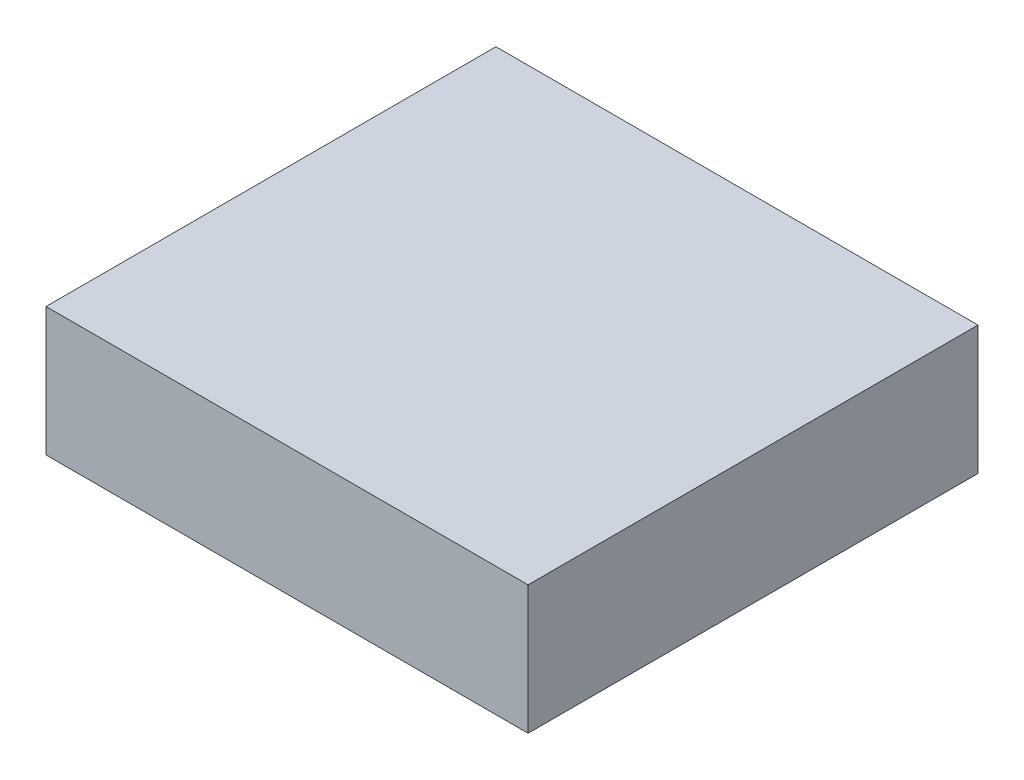
ISO-10303-21;
HEADER;
FILE_DESCRIPTION(('STEP AP214'),'2;1');
FILE_NAME('part.step','',(''),(''),'','','');
FILE_SCHEMA(('AUTOMOTIVE_DESIGN { 1 0 10303 214 1 1 1 1 }'));
ENDSEC;
DATA;
#1=APPLICATION_CONTEXT('core data for automotive mechanical design processes');
#2=APPLICATION_PROTOCOL_DEFINITION('international standard','automotive_design',2000,#1);
#3=PRODUCT_CONTEXT('',#1,'mechanical');
#4=PRODUCT('Part','Part','',(#3));
#5=PRODUCT_RELATED_PRODUCT_CATEGORY('part','',(#4));
#6=PRODUCT_DEFINITION_FORMATION('','',#4);
#7=PRODUCT_DEFINITION_CONTEXT('part definition',#1,'design');
#8=PRODUCT_DEFINITION('design','',#6,#7);
#9=PRODUCT_DEFINITION_SHAPE('','',#8);
#10=(LENGTH_UNIT() NAMED_UNIT(*) SI_UNIT(.MILLI.,.METRE.));
#11=(NAMED_UNIT(*) PLANE_ANGLE_UNIT() SI_UNIT($,.RADIAN.));
#12=(NAMED_UNIT(*) SI_UNIT($,.STERADIAN.) SOLID_ANGLE_UNIT());
#13=UNCERTAINTY_MEASURE_WITH_UNIT(LENGTH_MEASURE(1.E-05),#10,'distance_accuracy_value','');
#14=(GEOMETRIC_REPRESENTATION_CONTEXT(3) GLOBAL_UNCERTAINTY_ASSIGNED_CONTEXT((#13)) GLOBAL_UNIT_ASSIGNED_CONTEXT((#10,
#11,#12)) REPRESENTATION_CONTEXT('',''));
#15=CARTESIAN_POINT('',(0.,0.,0.));
#16=DIRECTION('',(0.,0.,1.));
#17=DIRECTION('',(1.,0.,0.));
#18=AXIS2_PLACEMENT_3D('',#15,#16,#17);
#19=CARTESIAN_POINT('',(-21.7948717948718,12.,-16.4102564102564));
#20=DIRECTION('',(1.,0.,0.));
#21=DIRECTION('',(0.,0.,-1.));
#22=AXIS2_PLACEMENT_3D('',#19,#20,#21);
#23=PLANE('',#22);
#24=DIRECTION('',(0.,0.,1.));
#25=VECTOR('',#24,1.);
#26=CARTESIAN_POINT('',(-21.7948717948718,0.,-16.4102564102564));
#27=LINE('',#26,#25);
#28=CARTESIAN_POINT('',(-21.7948717948718,0.,-16.4102564102564));
#29=VERTEX_POINT('',#28);
#30=CARTESIAN_POINT('',(-21.7948717948718,0.,25.5897435897436));
#31=VERTEX_POINT('',#30);
#32=EDGE_CURVE('E95',#29,#31,#27,.T.);
#33=ORIENTED_EDGE('',*,*,#32,.T.);
#34=DIRECTION('',(0.,-1.,0.));
#35=VECTOR('',#34,1.);
#36=CARTESIAN_POINT('',(-21.7948717948718,12.,25.5897435897436));
#37=LINE('',#36,#35);
#38=CARTESIAN_POINT('',(-21.7948717948718,12.,25.5897435897436));
#39=VERTEX_POINT('',#38);
#40=EDGE_CURVE('E11',#39,#31,#37,.T.);
#41=ORIENTED_EDGE('',*,*,#40,.F.);
#42=DIRECTION('',(0.,0.,1.));
#43=VECTOR('',#42,1.);
#44=CARTESIAN_POINT('',(-21.7948717948718,12.,-16.4102564102564));
#45=LINE('',#44,#43);
#46=CARTESIAN_POINT('',(-21.7948717948718,12.,-16.4102564102564));
#47=VERTEX_POINT('',#46);
#48=EDGE_CURVE('E83',#47,#39,#45,.T.);
#49=ORIENTED_EDGE('',*,*,#48,.F.);
#50=DIRECTION('',(0.,-1.,0.));
#51=VECTOR('',#50,1.);
#52=CARTESIAN_POINT('',(-21.7948717948718,12.,-16.4102564102564));
#53=LINE('',#52,#51);
#54=EDGE_CURVE('E91',#47,#29,#53,.T.);
#55=ORIENTED_EDGE('',*,*,#54,.T.);
#56=EDGE_LOOP('',(#33,#41,#49,#55));
#57=FACE_BOUND('',#56,.T.);
#58=ADVANCED_FACE('F32',(#57),#23,.F.);
#59=CARTESIAN_POINT('',(-21.7948717948718,12.,25.5897435897436));
#60=DIRECTION('',(0.,0.,-1.));
#61=DIRECTION('',(-1.,0.,0.));
#62=AXIS2_PLACEMENT_3D('',#59,#60,#61);
#63=PLANE('',#62);
#64=DIRECTION('',(1.,0.,0.));
#65=VECTOR('',#64,1.);
#66=CARTESIAN_POINT('',(-21.7948717948718,0.,25.5897435897436));
#67=LINE('',#66,#65);
#68=CARTESIAN_POINT('',(23.2051282051282,0.,25.5897435897436));
#69=VERTEX_POINT('',#68);
#70=EDGE_CURVE('E87',#31,#69,#67,.T.);
#71=ORIENTED_EDGE('',*,*,#70,.T.);
#72=DIRECTION('',(0.,-1.,0.));
#73=VECTOR('',#72,1.);
#74=CARTESIAN_POINT('',(23.2051282051282,12.,25.5897435897436));
#75=LINE('',#74,#73);
#76=CARTESIAN_POINT('',(23.2051282051282,12.,25.5897435897436));
#77=VERTEX_POINT('',#76);
#78=EDGE_CURVE('E40',#77,#69,#75,.T.);
#79=ORIENTED_EDGE('',*,*,#78,.F.);
#80=DIRECTION('',(1.,0.,0.));
#81=VECTOR('',#80,1.);
#82=CARTESIAN_POINT('',(-21.7948717948718,12.,25.5897435897436));
#83=LINE('',#82,#81);
#84=EDGE_CURVE('E78',#39,#77,#83,.T.);
#85=ORIENTED_EDGE('',*,*,#84,.F.);
#86=ORIENTED_EDGE('',*,*,#40,.T.);
#87=EDGE_LOOP('',(#71,#79,#85,#86));
#88=FACE_BOUND('',#87,.T.);
#89=ADVANCED_FACE('F86',(#88),#63,.F.);
#90=CARTESIAN_POINT('',(23.2051282051282,12.,-16.4102564102564));
#91=DIRECTION('',(-1.,0.,0.));
#92=DIRECTION('',(0.,0.,1.));
#93=AXIS2_PLACEMENT_3D('',#90,#91,#92);
#94=PLANE('',#93);
#95=DIRECTION('',(0.,0.,-1.));
#96=VECTOR('',#95,1.);
#97=CARTESIAN_POINT('',(23.2051282051282,0.,-16.4102564102564));
#98=LINE('',#97,#96);
#99=CARTESIAN_POINT('',(23.2051282051282,0.,-16.4102564102564));
#100=VERTEX_POINT('',#99);
#101=EDGE_CURVE('E65',#69,#100,#98,.T.);
#102=ORIENTED_EDGE('',*,*,#101,.T.);
#103=DIRECTION('',(0.,-1.,0.));
#104=VECTOR('',#103,1.);
#105=CARTESIAN_POINT('',(23.2051282051282,12.,-16.4102564102564));
#106=LINE('',#105,#104);
#107=CARTESIAN_POINT('',(23.2051282051282,12.,-16.4102564102564));
#108=VERTEX_POINT('',#107);
#109=EDGE_CURVE('E88',#108,#100,#106,.T.);
#110=ORIENTED_EDGE('',*,*,#109,.F.);
#111=DIRECTION('',(0.,0.,-1.));
#112=VECTOR('',#111,1.);
#113=CARTESIAN_POINT('',(23.2051282051282,12.,-16.4102564102564));
#114=LINE('',#113,#112);
#115=EDGE_CURVE('E81',#77,#108,#114,.T.);
#116=ORIENTED_EDGE('',*,*,#115,.F.);
#117=ORIENTED_EDGE('',*,*,#78,.T.);
#118=EDGE_LOOP('',(#102,#110,#116,#117));
#119=FACE_BOUND('',#118,.T.);
#120=ADVANCED_FACE('F89',(#119),#94,.F.);
#121=CARTESIAN_POINT('',(-21.7948717948718,12.,-16.4102564102564));
#122=DIRECTION('',(0.,0.,1.));
#123=DIRECTION('',(1.,0.,0.));
#124=AXIS2_PLACEMENT_3D('',#121,#122,#123);
#125=PLANE('',#124);
#126=DIRECTION('',(-1.,0.,0.));
#127=VECTOR('',#126,1.);
#128=CARTESIAN_POINT('',(-21.7948717948718,0.,-16.4102564102564));
#129=LINE('',#128,#127);
#130=EDGE_CURVE('E71',#100,#29,#129,.T.);
#131=ORIENTED_EDGE('',*,*,#130,.T.);
#132=ORIENTED_EDGE('',*,*,#54,.F.);
#133=DIRECTION('',(-1.,0.,0.));
#134=VECTOR('',#133,1.);
#135=CARTESIAN_POINT('',(-21.7948717948718,12.,-16.4102564102564));
#136=LINE('',#135,#134);
#137=EDGE_CURVE('E48',#108,#47,#136,.T.);
#138=ORIENTED_EDGE('',*,*,#137,.F.);
#139=ORIENTED_EDGE('',*,*,#109,.T.);
#140=EDGE_LOOP('',(#131,#132,#138,#139));
#141=FACE_BOUND('',#140,.T.);
#142=ADVANCED_FACE('F102',(#141),#125,.F.);
#143=CARTESIAN_POINT('',(0.,12.,0.));
#144=DIRECTION('',(0.,1.,0.));
#145=DIRECTION('',(0.,0.,1.));
#146=AXIS2_PLACEMENT_3D('',#143,#144,#145);
#147=PLANE('',#146);
#148=ORIENTED_EDGE('',*,*,#48,.T.);
#149=ORIENTED_EDGE('',*,*,#84,.T.);
#150=ORIENTED_EDGE('',*,*,#115,.T.);
#151=ORIENTED_EDGE('',*,*,#137,.T.);
#152=EDGE_LOOP('',(#148,#149,#150,#151));
#153=FACE_BOUND('',#152,.T.);
#154=ADVANCED_FACE('F79',(#153),#147,.T.);
#155=CARTESIAN_POINT('',(0.,0.,0.));
#156=DIRECTION('',(0.,1.,0.));
#157=DIRECTION('',(0.,0.,1.));
#158=AXIS2_PLACEMENT_3D('',#155,#156,#157);
#159=PLANE('',#158);
#160=ORIENTED_EDGE('',*,*,#32,.F.);
#161=ORIENTED_EDGE('',*,*,#130,.F.);
#162=ORIENTED_EDGE('',*,*,#101,.F.);
#163=ORIENTED_EDGE('',*,*,#70,.F.);
#164=EDGE_LOOP('',(#160,#161,#162,#163));
#165=FACE_BOUND('',#164,.T.);
#166=ADVANCED_FACE('F105',(#165),#159,.F.);
#167=CLOSED_SHELL('',(#58,#89,#120,#142,#154,#166));
#168=MANIFOLD_SOLID_BREP('B2',#167);
#169=ADVANCED_BREP_SHAPE_REPRESENTATION('',(#18,#168),#14);
#170=SHAPE_DEFINITION_REPRESENTATION(#9,#169);
ENDSEC;
END-ISO-10303-21;
